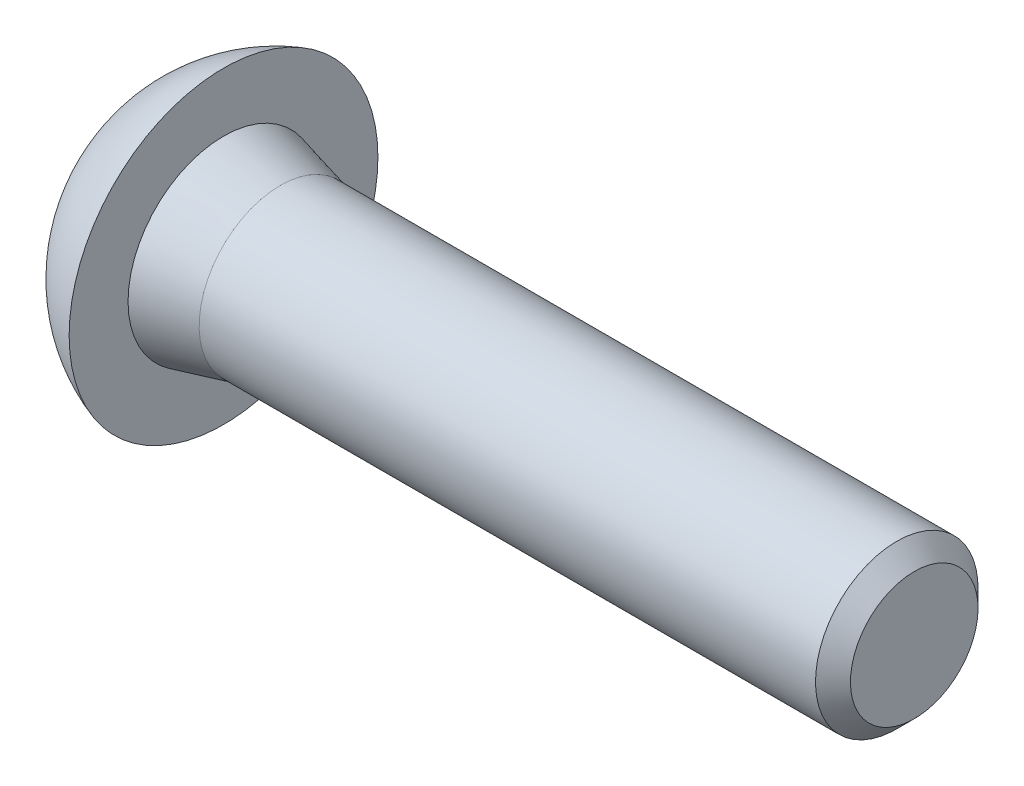
ISO-10303-21;
HEADER;
FILE_DESCRIPTION(('STEP AP214'),'2;1');
FILE_NAME('part.step','',(''),(''),'','','');
FILE_SCHEMA(('AUTOMOTIVE_DESIGN { 1 0 10303 214 1 1 1 1 }'));
ENDSEC;
DATA;
#1=APPLICATION_CONTEXT('core data for automotive mechanical design processes');
#2=APPLICATION_PROTOCOL_DEFINITION('international standard','automotive_design',2000,#1);
#3=PRODUCT_CONTEXT('',#1,'mechanical');
#4=PRODUCT('Part','Part','',(#3));
#5=PRODUCT_RELATED_PRODUCT_CATEGORY('part','',(#4));
#6=PRODUCT_DEFINITION_FORMATION('','',#4);
#7=PRODUCT_DEFINITION_CONTEXT('part definition',#1,'design');
#8=PRODUCT_DEFINITION('design','',#6,#7);
#9=PRODUCT_DEFINITION_SHAPE('','',#8);
#10=(LENGTH_UNIT() NAMED_UNIT(*) SI_UNIT(.MILLI.,.METRE.));
#11=(NAMED_UNIT(*) PLANE_ANGLE_UNIT() SI_UNIT($,.RADIAN.));
#12=(NAMED_UNIT(*) SI_UNIT($,.STERADIAN.) SOLID_ANGLE_UNIT());
#13=UNCERTAINTY_MEASURE_WITH_UNIT(LENGTH_MEASURE(1.E-05),#10,'distance_accuracy_value','');
#14=(GEOMETRIC_REPRESENTATION_CONTEXT(3) GLOBAL_UNCERTAINTY_ASSIGNED_CONTEXT((#13)) GLOBAL_UNIT_ASSIGNED_CONTEXT((#10,
#11,#12)) REPRESENTATION_CONTEXT('',''));
#15=CARTESIAN_POINT('',(0.,0.,0.));
#16=DIRECTION('',(0.,0.,1.));
#17=DIRECTION('',(1.,0.,0.));
#18=AXIS2_PLACEMENT_3D('',#15,#16,#17);
#19=CARTESIAN_POINT('',(-0.899999999944612,0.,0.));
#20=DIRECTION('',(-1.,0.,0.));
#21=DIRECTION('',(0.,0.,1.));
#22=AXIS2_PLACEMENT_3D('',#19,#20,#21);
#23=CONICAL_SURFACE('',#22,1.2499999999136,1.04719755118513);
#24=CARTESIAN_POINT('',(-0.495854811561003,0.,0.));
#25=DIRECTION('',(-1.,0.,0.));
#26=DIRECTION('',(0.,0.,1.));
#27=AXIS2_PLACEMENT_3D('',#24,#25,#26);
#28=CIRCLE('',#27,0.55);
#29=CARTESIAN_POINT('',(-0.495854811561003,0.,0.55));
#30=VERTEX_POINT('',#29);
#31=EDGE_CURVE('E254',#30,#30,#28,.T.);
#32=ORIENTED_EDGE('',*,*,#31,.F.);
#33=EDGE_LOOP('',(#32));
#34=FACE_BOUND('',#33,.T.);
#35=CARTESIAN_POINT('',(-0.900000000010249,0.,0.));
#36=DIRECTION('',(-1.,0.,0.));
#37=DIRECTION('',(0.,0.,1.));
#38=AXIS2_PLACEMENT_3D('',#35,#36,#37);
#39=CIRCLE('',#38,1.25000000002728);
#40=CARTESIAN_POINT('',(-0.900000000005124,-1.08253175474236,-0.62500000000682));
#41=VERTEX_POINT('',#40);
#42=CARTESIAN_POINT('',(-0.900000000005124,-1.08253175474236,0.62500000000682));
#43=VERTEX_POINT('',#42);
#44=EDGE_CURVE('E90',#41,#43,#39,.T.);
#45=ORIENTED_EDGE('',*,*,#44,.T.);
#46=CARTESIAN_POINT('',(-0.900000000010249,0.,0.));
#47=DIRECTION('',(-1.,0.,0.));
#48=DIRECTION('',(0.,0.,1.));
#49=AXIS2_PLACEMENT_3D('',#46,#47,#48);
#50=CIRCLE('',#49,1.25000000002728);
#51=CARTESIAN_POINT('',(-0.900000000005125,0.,1.25000000001364));
#52=VERTEX_POINT('',#51);
#53=EDGE_CURVE('E93',#43,#52,#50,.T.);
#54=ORIENTED_EDGE('',*,*,#53,.T.);
#55=CARTESIAN_POINT('',(-0.900000000010249,0.,0.));
#56=DIRECTION('',(-1.,0.,0.));
#57=DIRECTION('',(0.,0.,1.));
#58=AXIS2_PLACEMENT_3D('',#55,#56,#57);
#59=CIRCLE('',#58,1.25000000002728);
#60=CARTESIAN_POINT('',(-0.900000000005124,1.08253175474236,0.62500000000682));
#61=VERTEX_POINT('',#60);
#62=EDGE_CURVE('E109',#52,#61,#59,.T.);
#63=ORIENTED_EDGE('',*,*,#62,.T.);
#64=CARTESIAN_POINT('',(-0.900000000010249,0.,0.));
#65=DIRECTION('',(-1.,0.,0.));
#66=DIRECTION('',(0.,0.,1.));
#67=AXIS2_PLACEMENT_3D('',#64,#65,#66);
#68=CIRCLE('',#67,1.25000000002728);
#69=CARTESIAN_POINT('',(-0.900000000005124,1.08253175474236,-0.62500000000682));
#70=VERTEX_POINT('',#69);
#71=EDGE_CURVE('E118',#61,#70,#68,.T.);
#72=ORIENTED_EDGE('',*,*,#71,.T.);
#73=CARTESIAN_POINT('',(-0.900000000010249,0.,0.));
#74=DIRECTION('',(-1.,0.,0.));
#75=DIRECTION('',(0.,0.,1.));
#76=AXIS2_PLACEMENT_3D('',#73,#74,#75);
#77=CIRCLE('',#76,1.25000000002728);
#78=CARTESIAN_POINT('',(-0.900000000005125,0.,-1.25000000001364));
#79=VERTEX_POINT('',#78);
#80=EDGE_CURVE('E187',#70,#79,#77,.T.);
#81=ORIENTED_EDGE('',*,*,#80,.T.);
#82=CARTESIAN_POINT('',(-0.900000000010249,0.,0.));
#83=DIRECTION('',(-1.,0.,0.));
#84=DIRECTION('',(0.,0.,1.));
#85=AXIS2_PLACEMENT_3D('',#82,#83,#84);
#86=CIRCLE('',#85,1.25000000002728);
#87=EDGE_CURVE('E87',#79,#41,#86,.T.);
#88=ORIENTED_EDGE('',*,*,#87,.T.);
#89=EDGE_LOOP('',(#45,#54,#63,#72,#81,#88));
#90=FACE_BOUND('',#89,.T.);
#91=ADVANCED_FACE('F19',(#34,#90),#23,.F.);
#92=CARTESIAN_POINT('',(-0.9,0.,0.));
#93=DIRECTION('',(1.,0.,0.));
#94=DIRECTION('',(0.,0.,-1.));
#95=AXIS2_PLACEMENT_3D('',#92,#93,#94);
#96=PLANE('',#95);
#97=DIRECTION('',(0.,0.5,-0.866025403784439));
#98=VECTOR('',#97,1.);
#99=CARTESIAN_POINT('',(-0.9,-0.721687836487032,-1.25));
#100=LINE('',#99,#98);
#101=CARTESIAN_POINT('',(-0.9,-1.44337567297406,0.));
#102=VERTEX_POINT('',#101);
#103=EDGE_CURVE('E103',#41,#102,#100,.F.);
#104=ORIENTED_EDGE('',*,*,#103,.T.);
#105=DIRECTION('',(0.,-0.5,-0.866025403784439));
#106=VECTOR('',#105,1.);
#107=CARTESIAN_POINT('',(-0.9,-1.44337567297406,0.));
#108=LINE('',#107,#106);
#109=EDGE_CURVE('E101',#102,#43,#108,.F.);
#110=ORIENTED_EDGE('',*,*,#109,.T.);
#111=ORIENTED_EDGE('',*,*,#44,.F.);
#112=EDGE_LOOP('',(#104,#110,#111));
#113=FACE_BOUND('',#112,.T.);
#114=ADVANCED_FACE('F102',(#113),#96,.F.);
#115=CARTESIAN_POINT('',(-0.9,0.,0.));
#116=DIRECTION('',(1.,0.,0.));
#117=DIRECTION('',(0.,0.,-1.));
#118=AXIS2_PLACEMENT_3D('',#115,#116,#117);
#119=PLANE('',#118);
#120=DIRECTION('',(0.,1.,0.));
#121=VECTOR('',#120,1.);
#122=CARTESIAN_POINT('',(-0.9,0.721687836487032,-1.25));
#123=LINE('',#122,#121);
#124=CARTESIAN_POINT('',(-0.9,-0.721687836487032,-1.25));
#125=VERTEX_POINT('',#124);
#126=EDGE_CURVE('E164',#79,#125,#123,.F.);
#127=ORIENTED_EDGE('',*,*,#126,.T.);
#128=DIRECTION('',(0.,0.5,-0.866025403784439));
#129=VECTOR('',#128,1.);
#130=CARTESIAN_POINT('',(-0.9,-0.721687836487032,-1.25));
#131=LINE('',#130,#129);
#132=EDGE_CURVE('E124',#125,#41,#131,.F.);
#133=ORIENTED_EDGE('',*,*,#132,.T.);
#134=ORIENTED_EDGE('',*,*,#87,.F.);
#135=EDGE_LOOP('',(#127,#133,#134));
#136=FACE_BOUND('',#135,.T.);
#137=ADVANCED_FACE('F407',(#136),#119,.F.);
#138=CARTESIAN_POINT('',(-0.9,0.,0.));
#139=DIRECTION('',(1.,0.,0.));
#140=DIRECTION('',(0.,0.,-1.));
#141=AXIS2_PLACEMENT_3D('',#138,#139,#140);
#142=PLANE('',#141);
#143=DIRECTION('',(0.,0.5,0.866025403784439));
#144=VECTOR('',#143,1.);
#145=CARTESIAN_POINT('',(-0.9,1.44337567297406,0.));
#146=LINE('',#145,#144);
#147=CARTESIAN_POINT('',(-0.9,0.721687836487029,-1.25));
#148=VERTEX_POINT('',#147);
#149=EDGE_CURVE('E153',#70,#148,#146,.F.);
#150=ORIENTED_EDGE('',*,*,#149,.T.);
#151=DIRECTION('',(0.,1.,0.));
#152=VECTOR('',#151,1.);
#153=CARTESIAN_POINT('',(-0.9,0.721687836487032,-1.25));
#154=LINE('',#153,#152);
#155=EDGE_CURVE('E160',#148,#79,#154,.F.);
#156=ORIENTED_EDGE('',*,*,#155,.T.);
#157=ORIENTED_EDGE('',*,*,#80,.F.);
#158=EDGE_LOOP('',(#150,#156,#157));
#159=FACE_BOUND('',#158,.T.);
#160=ADVANCED_FACE('F398',(#159),#142,.F.);
#161=CARTESIAN_POINT('',(-0.9,0.,0.));
#162=DIRECTION('',(1.,0.,0.));
#163=DIRECTION('',(0.,0.,-1.));
#164=AXIS2_PLACEMENT_3D('',#161,#162,#163);
#165=PLANE('',#164);
#166=DIRECTION('',(0.,-0.5,0.866025403784439));
#167=VECTOR('',#166,1.);
#168=CARTESIAN_POINT('',(-0.9,0.721687836487032,1.25));
#169=LINE('',#168,#167);
#170=CARTESIAN_POINT('',(-0.9,1.44337567297406,0.));
#171=VERTEX_POINT('',#170);
#172=EDGE_CURVE('E144',#61,#171,#169,.F.);
#173=ORIENTED_EDGE('',*,*,#172,.T.);
#174=DIRECTION('',(0.,0.5,0.866025403784439));
#175=VECTOR('',#174,1.);
#176=CARTESIAN_POINT('',(-0.9,1.44337567297406,0.));
#177=LINE('',#176,#175);
#178=EDGE_CURVE('E149',#171,#70,#177,.F.);
#179=ORIENTED_EDGE('',*,*,#178,.T.);
#180=ORIENTED_EDGE('',*,*,#71,.F.);
#181=EDGE_LOOP('',(#173,#179,#180));
#182=FACE_BOUND('',#181,.T.);
#183=ADVANCED_FACE('F390',(#182),#165,.F.);
#184=CARTESIAN_POINT('',(-0.9,0.,0.));
#185=DIRECTION('',(1.,0.,0.));
#186=DIRECTION('',(0.,0.,-1.));
#187=AXIS2_PLACEMENT_3D('',#184,#185,#186);
#188=PLANE('',#187);
#189=DIRECTION('',(0.,-0.5,-0.866025403784439));
#190=VECTOR('',#189,1.);
#191=CARTESIAN_POINT('',(-0.9,-1.44337567297406,0.));
#192=LINE('',#191,#190);
#193=CARTESIAN_POINT('',(-0.9,-0.721687836487031,1.25));
#194=VERTEX_POINT('',#193);
#195=EDGE_CURVE('E108',#43,#194,#192,.F.);
#196=ORIENTED_EDGE('',*,*,#195,.T.);
#197=DIRECTION('',(0.,1.,0.));
#198=VECTOR('',#197,1.);
#199=CARTESIAN_POINT('',(-0.9,-0.721687836487032,1.25));
#200=LINE('',#199,#198);
#201=EDGE_CURVE('E115',#194,#52,#200,.T.);
#202=ORIENTED_EDGE('',*,*,#201,.T.);
#203=ORIENTED_EDGE('',*,*,#53,.F.);
#204=EDGE_LOOP('',(#196,#202,#203));
#205=FACE_BOUND('',#204,.T.);
#206=ADVANCED_FACE('F112',(#205),#188,.F.);
#207=CARTESIAN_POINT('',(-0.9,0.,0.));
#208=DIRECTION('',(1.,0.,0.));
#209=DIRECTION('',(0.,0.,-1.));
#210=AXIS2_PLACEMENT_3D('',#207,#208,#209);
#211=PLANE('',#210);
#212=DIRECTION('',(0.,1.,0.));
#213=VECTOR('',#212,1.);
#214=CARTESIAN_POINT('',(-0.9,-0.721687836487032,1.25));
#215=LINE('',#214,#213);
#216=CARTESIAN_POINT('',(-0.9,0.721687836487032,1.25));
#217=VERTEX_POINT('',#216);
#218=EDGE_CURVE('E272',#52,#217,#215,.T.);
#219=ORIENTED_EDGE('',*,*,#218,.T.);
#220=DIRECTION('',(0.,-0.5,0.866025403784439));
#221=VECTOR('',#220,1.);
#222=CARTESIAN_POINT('',(-0.9,0.721687836487032,1.25));
#223=LINE('',#222,#221);
#224=EDGE_CURVE('E148',#217,#61,#223,.F.);
#225=ORIENTED_EDGE('',*,*,#224,.T.);
#226=ORIENTED_EDGE('',*,*,#62,.F.);
#227=EDGE_LOOP('',(#219,#225,#226));
#228=FACE_BOUND('',#227,.T.);
#229=ADVANCED_FACE('F374',(#228),#211,.F.);
#230=CARTESIAN_POINT('',(-2.2,-1.44337567297406,0.));
#231=DIRECTION('',(0.,-0.866025403784439,0.5));
#232=DIRECTION('',(0.,-0.5,-0.866025403784439));
#233=AXIS2_PLACEMENT_3D('',#230,#231,#232);
#234=PLANE('',#233);
#235=DIRECTION('',(1.,0.,0.));
#236=VECTOR('',#235,1.);
#237=CARTESIAN_POINT('',(-2.2,-0.721687836487032,1.25));
#238=LINE('',#237,#236);
#239=CARTESIAN_POINT('',(-2.2,-0.721687836487032,1.25));
#240=VERTEX_POINT('',#239);
#241=EDGE_CURVE('E122',#240,#194,#238,.T.);
#242=ORIENTED_EDGE('',*,*,#241,.T.);
#243=ORIENTED_EDGE('',*,*,#195,.F.);
#244=ORIENTED_EDGE('',*,*,#109,.F.);
#245=DIRECTION('',(1.,0.,0.));
#246=VECTOR('',#245,1.);
#247=CARTESIAN_POINT('',(-2.2,-1.44337567297406,0.));
#248=LINE('',#247,#246);
#249=CARTESIAN_POINT('',(-2.2,-1.44337567297406,0.));
#250=VERTEX_POINT('',#249);
#251=EDGE_CURVE('E165',#102,#250,#248,.F.);
#252=ORIENTED_EDGE('',*,*,#251,.T.);
#253=DIRECTION('',(0.,-0.5,-0.86602540378444));
#254=VECTOR('',#253,1.);
#255=CARTESIAN_POINT('',(-2.2,-0.721687836487032,1.25));
#256=LINE('',#255,#254);
#257=EDGE_CURVE('E133',#240,#250,#256,.T.);
#258=ORIENTED_EDGE('',*,*,#257,.F.);
#259=EDGE_LOOP('',(#242,#243,#244,#252,#258));
#260=FACE_BOUND('',#259,.T.);
#261=ADVANCED_FACE('F120',(#260),#234,.F.);
#262=CARTESIAN_POINT('',(-2.2,-0.721687836487032,-1.25));
#263=DIRECTION('',(0.,-0.866025403784439,-0.5));
#264=DIRECTION('',(0.,0.5,-0.866025403784439));
#265=AXIS2_PLACEMENT_3D('',#262,#263,#264);
#266=PLANE('',#265);
#267=ORIENTED_EDGE('',*,*,#251,.F.);
#268=ORIENTED_EDGE('',*,*,#103,.F.);
#269=ORIENTED_EDGE('',*,*,#132,.F.);
#270=DIRECTION('',(-1.,0.,0.));
#271=VECTOR('',#270,1.);
#272=CARTESIAN_POINT('',(-2.2,-0.721687836487032,-1.25));
#273=LINE('',#272,#271);
#274=CARTESIAN_POINT('',(-2.2,-0.721687836487032,-1.25));
#275=VERTEX_POINT('',#274);
#276=EDGE_CURVE('E154',#125,#275,#273,.T.);
#277=ORIENTED_EDGE('',*,*,#276,.T.);
#278=DIRECTION('',(0.,0.5,-0.86602540378444));
#279=VECTOR('',#278,1.);
#280=CARTESIAN_POINT('',(-2.2,-1.44337567297406,0.));
#281=LINE('',#280,#279);
#282=EDGE_CURVE('E137',#250,#275,#281,.T.);
#283=ORIENTED_EDGE('',*,*,#282,.F.);
#284=EDGE_LOOP('',(#267,#268,#269,#277,#283));
#285=FACE_BOUND('',#284,.T.);
#286=ADVANCED_FACE('F357',(#285),#266,.F.);
#287=CARTESIAN_POINT('',(-2.2,0.721687836487032,-1.25));
#288=DIRECTION('',(0.,0.,-1.));
#289=DIRECTION('',(-1.,0.,0.));
#290=AXIS2_PLACEMENT_3D('',#287,#288,#289);
#291=PLANE('',#290);
#292=ORIENTED_EDGE('',*,*,#276,.F.);
#293=ORIENTED_EDGE('',*,*,#126,.F.);
#294=ORIENTED_EDGE('',*,*,#155,.F.);
#295=DIRECTION('',(1.,0.,0.));
#296=VECTOR('',#295,1.);
#297=CARTESIAN_POINT('',(-2.2,0.721687836487029,-1.25));
#298=LINE('',#297,#296);
#299=CARTESIAN_POINT('',(-2.2,0.721687836487031,-1.25));
#300=VERTEX_POINT('',#299);
#301=EDGE_CURVE('E159',#148,#300,#298,.F.);
#302=ORIENTED_EDGE('',*,*,#301,.T.);
#303=DIRECTION('',(0.,1.,0.));
#304=VECTOR('',#303,1.);
#305=CARTESIAN_POINT('',(-2.2,1.575,-1.25));
#306=LINE('',#305,#304);
#307=EDGE_CURVE('E263',#275,#300,#306,.T.);
#308=ORIENTED_EDGE('',*,*,#307,.F.);
#309=EDGE_LOOP('',(#292,#293,#294,#302,#308));
#310=FACE_BOUND('',#309,.T.);
#311=ADVANCED_FACE('F348',(#310),#291,.F.);
#312=CARTESIAN_POINT('',(-2.2,1.44337567297406,0.));
#313=DIRECTION('',(0.,0.866025403784439,-0.5));
#314=DIRECTION('',(0.,0.5,0.866025403784439));
#315=AXIS2_PLACEMENT_3D('',#312,#313,#314);
#316=PLANE('',#315);
#317=ORIENTED_EDGE('',*,*,#301,.F.);
#318=ORIENTED_EDGE('',*,*,#149,.F.);
#319=ORIENTED_EDGE('',*,*,#178,.F.);
#320=DIRECTION('',(1.,0.,0.));
#321=VECTOR('',#320,1.);
#322=CARTESIAN_POINT('',(-2.2,1.44337567297406,0.));
#323=LINE('',#322,#321);
#324=CARTESIAN_POINT('',(-2.2,1.44337567297406,0.));
#325=VERTEX_POINT('',#324);
#326=EDGE_CURVE('E147',#171,#325,#323,.F.);
#327=ORIENTED_EDGE('',*,*,#326,.T.);
#328=DIRECTION('',(0.,0.5,0.86602540378444));
#329=VECTOR('',#328,1.);
#330=CARTESIAN_POINT('',(-2.2,0.721687836487032,-1.25));
#331=LINE('',#330,#329);
#332=EDGE_CURVE('E259',#300,#325,#331,.T.);
#333=ORIENTED_EDGE('',*,*,#332,.F.);
#334=EDGE_LOOP('',(#317,#318,#319,#327,#333));
#335=FACE_BOUND('',#334,.T.);
#336=ADVANCED_FACE('F340',(#335),#316,.F.);
#337=CARTESIAN_POINT('',(-2.2,0.721687836487032,1.25));
#338=DIRECTION('',(0.,0.866025403784439,0.5));
#339=DIRECTION('',(0.,-0.5,0.866025403784439));
#340=AXIS2_PLACEMENT_3D('',#337,#338,#339);
#341=PLANE('',#340);
#342=ORIENTED_EDGE('',*,*,#326,.F.);
#343=ORIENTED_EDGE('',*,*,#172,.F.);
#344=ORIENTED_EDGE('',*,*,#224,.F.);
#345=DIRECTION('',(1.,0.,0.));
#346=VECTOR('',#345,1.);
#347=CARTESIAN_POINT('',(-2.2,0.721687836487032,1.25));
#348=LINE('',#347,#346);
#349=CARTESIAN_POINT('',(-2.2,0.721687836487032,1.25));
#350=VERTEX_POINT('',#349);
#351=EDGE_CURVE('E36',#217,#350,#348,.F.);
#352=ORIENTED_EDGE('',*,*,#351,.T.);
#353=DIRECTION('',(0.,-0.5,0.86602540378444));
#354=VECTOR('',#353,1.);
#355=CARTESIAN_POINT('',(-2.2,1.44337567297406,0.));
#356=LINE('',#355,#354);
#357=EDGE_CURVE('E143',#325,#350,#356,.T.);
#358=ORIENTED_EDGE('',*,*,#357,.F.);
#359=EDGE_LOOP('',(#342,#343,#344,#352,#358));
#360=FACE_BOUND('',#359,.T.);
#361=ADVANCED_FACE('F332',(#360),#341,.F.);
#362=CARTESIAN_POINT('',(-2.2,-0.721687836487032,1.25));
#363=DIRECTION('',(0.,0.,1.));
#364=DIRECTION('',(1.,0.,0.));
#365=AXIS2_PLACEMENT_3D('',#362,#363,#364);
#366=PLANE('',#365);
#367=ORIENTED_EDGE('',*,*,#351,.F.);
#368=ORIENTED_EDGE('',*,*,#218,.F.);
#369=ORIENTED_EDGE('',*,*,#201,.F.);
#370=ORIENTED_EDGE('',*,*,#241,.F.);
#371=DIRECTION('',(0.,1.,0.));
#372=VECTOR('',#371,1.);
#373=CARTESIAN_POINT('',(-2.2,1.575,1.25));
#374=LINE('',#373,#372);
#375=EDGE_CURVE('E138',#350,#240,#374,.F.);
#376=ORIENTED_EDGE('',*,*,#375,.F.);
#377=EDGE_LOOP('',(#367,#368,#369,#370,#376));
#378=FACE_BOUND('',#377,.T.);
#379=ADVANCED_FACE('F324',(#378),#366,.F.);
#380=CARTESIAN_POINT('',(-2.2,1.575,0.));
#381=DIRECTION('',(-1.,0.,0.));
#382=DIRECTION('',(0.,0.,1.));
#383=AXIS2_PLACEMENT_3D('',#380,#381,#382);
#384=PLANE('',#383);
#385=CARTESIAN_POINT('',(-2.2,0.,0.));
#386=DIRECTION('',(-1.,0.,0.));
#387=DIRECTION('',(0.,0.,1.));
#388=AXIS2_PLACEMENT_3D('',#385,#386,#387);
#389=CIRCLE('',#388,1.9);
#390=CARTESIAN_POINT('',(-2.2,0.,1.9));
#391=VERTEX_POINT('',#390);
#392=EDGE_CURVE('E142',#391,#391,#389,.F.);
#393=ORIENTED_EDGE('',*,*,#392,.F.);
#394=EDGE_LOOP('',(#393));
#395=FACE_BOUND('',#394,.T.);
#396=ORIENTED_EDGE('',*,*,#357,.T.);
#397=ORIENTED_EDGE('',*,*,#375,.T.);
#398=ORIENTED_EDGE('',*,*,#257,.T.);
#399=ORIENTED_EDGE('',*,*,#282,.T.);
#400=ORIENTED_EDGE('',*,*,#307,.T.);
#401=ORIENTED_EDGE('',*,*,#332,.T.);
#402=EDGE_LOOP('',(#396,#397,#398,#399,#400,#401));
#403=FACE_BOUND('',#402,.T.);
#404=ADVANCED_FACE('F242',(#395,#403),#384,.T.);
#405=CARTESIAN_POINT('',(1.19489464248761,0.,0.192753571856441));
#406=DIRECTION('',(0.,1.,0.));
#407=DIRECTION('',(0.,0.,1.));
#408=AXIS2_PLACEMENT_3D('',#405,#406,#407);
#409=CIRCLE('',#408,3.8);
#410=TRIMMED_CURVE('',#409,(PARAMETER_VALUE(-1.62154272849604)),
(PARAMETER_VALUE(1.62154272849604)),.T.,.PARAMETER.);
#411=CARTESIAN_POINT('',(1.19489464248761,0.,0.));
#412=DIRECTION('',(-1.,0.,0.));
#413=AXIS1_PLACEMENT('',#411,#412);
#414=SURFACE_OF_REVOLUTION('',#410,#413);
#415=ORIENTED_EDGE('',*,*,#392,.T.);
#416=EDGE_LOOP('',(#415));
#417=FACE_BOUND('',#416,.T.);
#418=CARTESIAN_POINT('',(0.,0.,0.));
#419=DIRECTION('',(-1.,0.,0.));
#420=DIRECTION('',(0.,0.,1.));
#421=AXIS2_PLACEMENT_3D('',#418,#419,#420);
#422=CIRCLE('',#421,3.8);
#423=CARTESIAN_POINT('',(0.,0.,3.8));
#424=VERTEX_POINT('',#423);
#425=EDGE_CURVE('E176',#424,#424,#422,.F.);
#426=ORIENTED_EDGE('',*,*,#425,.F.);
#427=EDGE_LOOP('',(#426));
#428=FACE_BOUND('',#427,.T.);
#429=ADVANCED_FACE('F231',(#417,#428),#414,.F.);
#430=CARTESIAN_POINT('',(0.,3.075,0.));
#431=DIRECTION('',(1.,0.,0.));
#432=DIRECTION('',(0.,1.,0.));
#433=AXIS2_PLACEMENT_3D('',#430,#431,#432);
#434=PLANE('',#433);
#435=CARTESIAN_POINT('',(0.,0.,0.));
#436=DIRECTION('',(1.,0.,0.));
#437=DIRECTION('',(0.,1.,0.));
#438=AXIS2_PLACEMENT_3D('',#435,#436,#437);
#439=CIRCLE('',#438,2.35000000000696);
#440=CARTESIAN_POINT('',(0.,2.35000000000696,0.));
#441=VERTEX_POINT('',#440);
#442=EDGE_CURVE('E577',#441,#441,#439,.T.);
#443=ORIENTED_EDGE('',*,*,#442,.F.);
#444=EDGE_LOOP('',(#443));
#445=FACE_BOUND('',#444,.T.);
#446=ORIENTED_EDGE('',*,*,#425,.T.);
#447=EDGE_LOOP('',(#446));
#448=FACE_BOUND('',#447,.T.);
#449=ADVANCED_FACE('F228',(#445,#448),#434,.T.);
#450=CARTESIAN_POINT('',(-1.55,0.,0.));
#451=DIRECTION('',(1.,0.,0.));
#452=DIRECTION('',(0.,0.,-1.));
#453=AXIS2_PLACEMENT_3D('',#450,#451,#452);
#454=CYLINDRICAL_SURFACE('',#453,0.55);
#455=CARTESIAN_POINT('',(-1.55,0.,0.));
#456=DIRECTION('',(-1.,0.,0.));
#457=DIRECTION('',(0.,0.,1.));
#458=AXIS2_PLACEMENT_3D('',#455,#456,#457);
#459=CIRCLE('',#458,0.55);
#460=CARTESIAN_POINT('',(-1.55,0.,0.55));
#461=VERTEX_POINT('',#460);
#462=EDGE_CURVE('E98',#461,#461,#459,.T.);
#463=ORIENTED_EDGE('',*,*,#462,.F.);
#464=EDGE_LOOP('',(#463));
#465=FACE_BOUND('',#464,.T.);
#466=ORIENTED_EDGE('',*,*,#31,.T.);
#467=EDGE_LOOP('',(#466));
#468=FACE_BOUND('',#467,.T.);
#469=ADVANCED_FACE('F230',(#465,#468),#454,.T.);
#470=CARTESIAN_POINT('',(-1.55,0.,0.));
#471=DIRECTION('',(-1.,0.,0.));
#472=DIRECTION('',(0.,0.,1.));
#473=AXIS2_PLACEMENT_3D('',#470,#471,#472);
#474=PLANE('',#473);
#475=ORIENTED_EDGE('',*,*,#462,.T.);
#476=EDGE_LOOP('',(#475));
#477=FACE_BOUND('',#476,.T.);
#478=ADVANCED_FACE('F239',(#477),#474,.T.);
#479=CARTESIAN_POINT('',(0.,0.,0.));
#480=DIRECTION('',(-1.,0.,0.));
#481=DIRECTION('',(0.,1.,0.));
#482=AXIS2_PLACEMENT_3D('',#479,#480,#481);
#483=CONICAL_SURFACE('',#482,2.35000000000696,0.244978663126861);
#484=CARTESIAN_POINT('',(1.4,0.,0.));
#485=DIRECTION('',(1.,0.,0.));
#486=DIRECTION('',(0.,1.,0.));
#487=AXIS2_PLACEMENT_3D('',#484,#485,#486);
#488=CIRCLE('',#487,2.00000000000696);
#489=CARTESIAN_POINT('',(1.4,2.00000000000696,0.));
#490=VERTEX_POINT('',#489);
#491=EDGE_CURVE('E576',#490,#490,#488,.T.);
#492=ORIENTED_EDGE('',*,*,#491,.F.);
#493=EDGE_LOOP('',(#492));
#494=FACE_BOUND('',#493,.T.);
#495=ORIENTED_EDGE('',*,*,#442,.T.);
#496=EDGE_LOOP('',(#495));
#497=FACE_BOUND('',#496,.T.);
#498=ADVANCED_FACE('F443',(#494,#497),#483,.T.);
#499=CARTESIAN_POINT('',(17.,0.,0.));
#500=DIRECTION('',(-1.,0.,0.));
#501=DIRECTION('',(0.,-1.,0.));
#502=AXIS2_PLACEMENT_3D('',#499,#500,#501);
#503=CYLINDRICAL_SURFACE('',#502,2.);
#504=CARTESIAN_POINT('',(16.5699655000309,0.,0.));
#505=DIRECTION('',(1.,0.,0.));
#506=DIRECTION('',(0.,1.,0.));
#507=AXIS2_PLACEMENT_3D('',#504,#505,#506);
#508=CIRCLE('',#507,2.);
#509=CARTESIAN_POINT('',(16.5699655000309,1.99999999999998,0.));
#510=VERTEX_POINT('',#509);
#511=EDGE_CURVE('E12',#510,#510,#508,.F.);
#512=ORIENTED_EDGE('',*,*,#511,.T.);
#513=EDGE_LOOP('',(#512));
#514=FACE_BOUND('',#513,.T.);
#515=ORIENTED_EDGE('',*,*,#491,.T.);
#516=EDGE_LOOP('',(#515));
#517=FACE_BOUND('',#516,.T.);
#518=ADVANCED_FACE('F225',(#514,#517),#503,.T.);
#519=CARTESIAN_POINT('',(17.,0.,0.));
#520=DIRECTION('',(1.,0.,0.));
#521=DIRECTION('',(0.,1.,0.));
#522=AXIS2_PLACEMENT_3D('',#519,#520,#521);
#523=PLANE('',#522);
#524=CARTESIAN_POINT('',(17.,0.,0.));
#525=DIRECTION('',(1.,0.,0.));
#526=DIRECTION('',(0.,1.,0.));
#527=AXIS2_PLACEMENT_3D('',#524,#525,#526);
#528=CIRCLE('',#527,1.56996550003084);
#529=CARTESIAN_POINT('',(17.,1.56996550003082,0.));
#530=VERTEX_POINT('',#529);
#531=EDGE_CURVE('E28',#530,#530,#528,.T.);
#532=ORIENTED_EDGE('',*,*,#531,.T.);
#533=EDGE_LOOP('',(#532));
#534=FACE_BOUND('',#533,.T.);
#535=ADVANCED_FACE('F216',(#534),#523,.T.);
#536=CARTESIAN_POINT('',(17.,0.,0.));
#537=DIRECTION('',(-1.,0.,0.));
#538=DIRECTION('',(0.,-1.,0.));
#539=AXIS2_PLACEMENT_3D('',#536,#537,#538);
#540=CONICAL_SURFACE('',#539,1.56996550003084,0.785398163397448);
#541=ORIENTED_EDGE('',*,*,#511,.F.);
#542=EDGE_LOOP('',(#541));
#543=FACE_BOUND('',#542,.T.);
#544=ORIENTED_EDGE('',*,*,#531,.F.);
#545=EDGE_LOOP('',(#544));
#546=FACE_BOUND('',#545,.T.);
#547=ADVANCED_FACE('F21',(#543,#546),#540,.T.);
#548=CLOSED_SHELL('',(#91,#114,#137,#160,#183,#206,#229,#261,#286,#311,#336,#361,#379,#404,#429,
#449,#469,#478,#498,#518,#535,#547));
#549=MANIFOLD_SOLID_BREP('B1',#548);
#550=ADVANCED_BREP_SHAPE_REPRESENTATION('',(#18,#549),#14);
#551=SHAPE_DEFINITION_REPRESENTATION(#9,#550);
ENDSEC;
END-ISO-10303-21;
